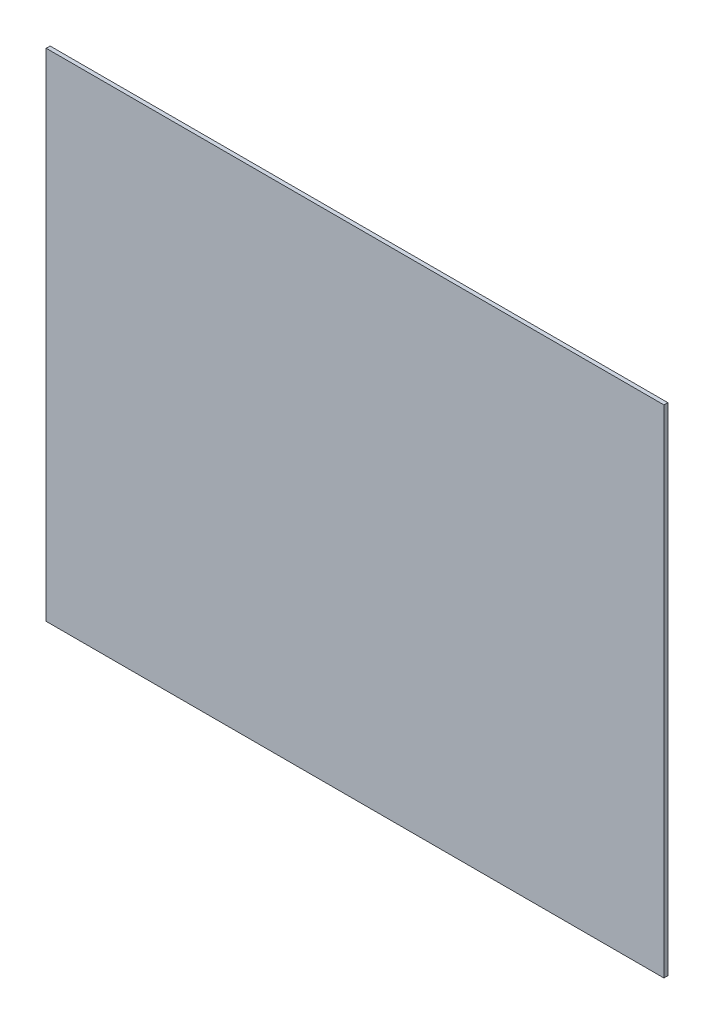
ISO-10303-21;
HEADER;
FILE_DESCRIPTION(('STEP AP214'),'2;1');
FILE_NAME('part.step','',(''),(''),'','','');
FILE_SCHEMA(('AUTOMOTIVE_DESIGN { 1 0 10303 214 1 1 1 1 }'));
ENDSEC;
DATA;
#1=APPLICATION_CONTEXT('core data for automotive mechanical design processes');
#2=APPLICATION_PROTOCOL_DEFINITION('international standard','automotive_design',2000,#1);
#3=PRODUCT_CONTEXT('',#1,'mechanical');
#4=PRODUCT('Part','Part','',(#3));
#5=PRODUCT_RELATED_PRODUCT_CATEGORY('part','',(#4));
#6=PRODUCT_DEFINITION_FORMATION('','',#4);
#7=PRODUCT_DEFINITION_CONTEXT('part definition',#1,'design');
#8=PRODUCT_DEFINITION('design','',#6,#7);
#9=PRODUCT_DEFINITION_SHAPE('','',#8);
#10=(LENGTH_UNIT() NAMED_UNIT(*) SI_UNIT(.MILLI.,.METRE.));
#11=(NAMED_UNIT(*) PLANE_ANGLE_UNIT() SI_UNIT($,.RADIAN.));
#12=(NAMED_UNIT(*) SI_UNIT($,.STERADIAN.) SOLID_ANGLE_UNIT());
#13=UNCERTAINTY_MEASURE_WITH_UNIT(LENGTH_MEASURE(1.E-05),#10,'distance_accuracy_value','');
#14=(GEOMETRIC_REPRESENTATION_CONTEXT(3) GLOBAL_UNCERTAINTY_ASSIGNED_CONTEXT((#13)) GLOBAL_UNIT_ASSIGNED_CONTEXT((#10,
#11,#12)) REPRESENTATION_CONTEXT('',''));
#15=CARTESIAN_POINT('',(0.,0.,0.));
#16=DIRECTION('',(0.,0.,1.));
#17=DIRECTION('',(1.,0.,0.));
#18=AXIS2_PLACEMENT_3D('',#15,#16,#17);
#19=CARTESIAN_POINT('',(17.149826,51.074828,0.36703));
#20=DIRECTION('',(0.,1.,0.));
#21=DIRECTION('',(1.,0.,0.));
#22=AXIS2_PLACEMENT_3D('',#19,#20,#21);
#23=PLANE('',#22);
#24=DIRECTION('',(0.,0.,1.));
#25=VECTOR('',#24,1.);
#26=CARTESIAN_POINT('',(24.150066,51.074828,0.32258));
#27=LINE('',#26,#25);
#28=CARTESIAN_POINT('',(24.150066,51.074828,0.32258));
#29=VERTEX_POINT('',#28);
#30=CARTESIAN_POINT('',(24.150066,51.074828,0.36703));
#31=VERTEX_POINT('',#30);
#32=EDGE_CURVE('E11',#29,#31,#27,.T.);
#33=ORIENTED_EDGE('',*,*,#32,.T.);
#34=DIRECTION('',(-1.,0.,0.));
#35=VECTOR('',#34,1.);
#36=CARTESIAN_POINT('',(24.150066,51.074828,0.36703));
#37=LINE('',#36,#35);
#38=CARTESIAN_POINT('',(17.149826,51.074828,0.36703));
#39=VERTEX_POINT('',#38);
#40=EDGE_CURVE('E114',#31,#39,#37,.T.);
#41=ORIENTED_EDGE('',*,*,#40,.T.);
#42=DIRECTION('',(0.,0.,1.));
#43=VECTOR('',#42,1.);
#44=CARTESIAN_POINT('',(17.149826,51.074828,0.32258));
#45=LINE('',#44,#43);
#46=CARTESIAN_POINT('',(17.149826,51.074828,0.32258));
#47=VERTEX_POINT('',#46);
#48=EDGE_CURVE('E58',#47,#39,#45,.T.);
#49=ORIENTED_EDGE('',*,*,#48,.F.);
#50=DIRECTION('',(1.,0.,0.));
#51=VECTOR('',#50,1.);
#52=CARTESIAN_POINT('',(17.149826,51.074828,0.32258));
#53=LINE('',#52,#51);
#54=EDGE_CURVE('E83',#47,#29,#53,.T.);
#55=ORIENTED_EDGE('',*,*,#54,.T.);
#56=EDGE_LOOP('',(#33,#41,#49,#55));
#57=FACE_BOUND('',#56,.T.);
#58=ADVANCED_FACE('F18',(#57),#23,.F.);
#59=CARTESIAN_POINT('',(24.150066,51.074828,0.36703));
#60=DIRECTION('',(-1.,0.,0.));
#61=DIRECTION('',(0.,0.,1.));
#62=AXIS2_PLACEMENT_3D('',#59,#60,#61);
#63=PLANE('',#62);
#64=DIRECTION('',(0.,0.,-1.));
#65=VECTOR('',#64,1.);
#66=CARTESIAN_POINT('',(24.150066,56.699912,0.36703));
#67=LINE('',#66,#65);
#68=CARTESIAN_POINT('',(24.150066,56.699912,0.36703));
#69=VERTEX_POINT('',#68);
#70=CARTESIAN_POINT('',(24.150066,56.699912,0.32258));
#71=VERTEX_POINT('',#70);
#72=EDGE_CURVE('E92',#69,#71,#67,.T.);
#73=ORIENTED_EDGE('',*,*,#72,.F.);
#74=DIRECTION('',(0.,-1.,0.));
#75=VECTOR('',#74,1.);
#76=CARTESIAN_POINT('',(24.150066,56.699912,0.36703));
#77=LINE('',#76,#75);
#78=EDGE_CURVE('E27',#69,#31,#77,.T.);
#79=ORIENTED_EDGE('',*,*,#78,.T.);
#80=ORIENTED_EDGE('',*,*,#32,.F.);
#81=DIRECTION('',(0.,1.,0.));
#82=VECTOR('',#81,1.);
#83=CARTESIAN_POINT('',(24.150066,51.074828,0.32258));
#84=LINE('',#83,#82);
#85=EDGE_CURVE('E94',#29,#71,#84,.T.);
#86=ORIENTED_EDGE('',*,*,#85,.T.);
#87=EDGE_LOOP('',(#73,#79,#80,#86));
#88=FACE_BOUND('',#87,.T.);
#89=ADVANCED_FACE('F161',(#88),#63,.F.);
#90=CARTESIAN_POINT('',(0.,0.,0.36703));
#91=DIRECTION('',(0.,0.,1.));
#92=DIRECTION('',(1.,0.,0.));
#93=AXIS2_PLACEMENT_3D('',#90,#91,#92);
#94=PLANE('',#93);
#95=DIRECTION('',(0.,1.,0.));
#96=VECTOR('',#95,1.);
#97=CARTESIAN_POINT('',(17.149826,51.074828,0.36703));
#98=LINE('',#97,#96);
#99=CARTESIAN_POINT('',(17.149826,56.699912,0.36703));
#100=VERTEX_POINT('',#99);
#101=EDGE_CURVE('E68',#39,#100,#98,.T.);
#102=ORIENTED_EDGE('',*,*,#101,.F.);
#103=ORIENTED_EDGE('',*,*,#40,.F.);
#104=ORIENTED_EDGE('',*,*,#78,.F.);
#105=DIRECTION('',(1.,0.,0.));
#106=VECTOR('',#105,1.);
#107=CARTESIAN_POINT('',(17.149826,56.699912,0.36703));
#108=LINE('',#107,#106);
#109=EDGE_CURVE('E98',#100,#69,#108,.T.);
#110=ORIENTED_EDGE('',*,*,#109,.F.);
#111=EDGE_LOOP('',(#102,#103,#104,#110));
#112=FACE_BOUND('',#111,.T.);
#113=ADVANCED_FACE('F150',(#112),#94,.T.);
#114=CARTESIAN_POINT('',(17.149826,56.699912,0.36703));
#115=DIRECTION('',(1.,0.,0.));
#116=DIRECTION('',(0.,1.,0.));
#117=AXIS2_PLACEMENT_3D('',#114,#115,#116);
#118=PLANE('',#117);
#119=ORIENTED_EDGE('',*,*,#48,.T.);
#120=ORIENTED_EDGE('',*,*,#101,.T.);
#121=DIRECTION('',(0.,0.,1.));
#122=VECTOR('',#121,1.);
#123=CARTESIAN_POINT('',(17.149826,56.699912,0.32258));
#124=LINE('',#123,#122);
#125=CARTESIAN_POINT('',(17.149826,56.699912,0.32258));
#126=VERTEX_POINT('',#125);
#127=EDGE_CURVE('E90',#126,#100,#124,.T.);
#128=ORIENTED_EDGE('',*,*,#127,.F.);
#129=DIRECTION('',(0.,-1.,0.));
#130=VECTOR('',#129,1.);
#131=CARTESIAN_POINT('',(17.149826,56.699912,0.32258));
#132=LINE('',#131,#130);
#133=EDGE_CURVE('E77',#126,#47,#132,.T.);
#134=ORIENTED_EDGE('',*,*,#133,.T.);
#135=EDGE_LOOP('',(#119,#120,#128,#134));
#136=FACE_BOUND('',#135,.T.);
#137=ADVANCED_FACE('F96',(#136),#118,.F.);
#138=CARTESIAN_POINT('',(0.,0.,0.32258));
#139=DIRECTION('',(0.,0.,1.));
#140=DIRECTION('',(1.,0.,0.));
#141=AXIS2_PLACEMENT_3D('',#138,#139,#140);
#142=PLANE('',#141);
#143=ORIENTED_EDGE('',*,*,#85,.F.);
#144=ORIENTED_EDGE('',*,*,#54,.F.);
#145=ORIENTED_EDGE('',*,*,#133,.F.);
#146=DIRECTION('',(-1.,0.,0.));
#147=VECTOR('',#146,1.);
#148=CARTESIAN_POINT('',(24.150066,56.699912,0.32258));
#149=LINE('',#148,#147);
#150=EDGE_CURVE('E81',#71,#126,#149,.T.);
#151=ORIENTED_EDGE('',*,*,#150,.F.);
#152=EDGE_LOOP('',(#143,#144,#145,#151));
#153=FACE_BOUND('',#152,.T.);
#154=ADVANCED_FACE('F80',(#153),#142,.F.);
#155=CARTESIAN_POINT('',(24.150066,56.699912,0.36703));
#156=DIRECTION('',(0.,-1.,0.));
#157=DIRECTION('',(0.,0.,-1.));
#158=AXIS2_PLACEMENT_3D('',#155,#156,#157);
#159=PLANE('',#158);
#160=ORIENTED_EDGE('',*,*,#127,.T.);
#161=ORIENTED_EDGE('',*,*,#109,.T.);
#162=ORIENTED_EDGE('',*,*,#72,.T.);
#163=ORIENTED_EDGE('',*,*,#150,.T.);
#164=EDGE_LOOP('',(#160,#161,#162,#163));
#165=FACE_BOUND('',#164,.T.);
#166=ADVANCED_FACE('F88',(#165),#159,.F.);
#167=CLOSED_SHELL('',(#58,#89,#113,#137,#154,#166));
#168=MANIFOLD_SOLID_BREP('B1',#167);
#169=ADVANCED_BREP_SHAPE_REPRESENTATION('',(#18,#168),#14);
#170=SHAPE_DEFINITION_REPRESENTATION(#9,#169);
ENDSEC;
END-ISO-10303-21;
